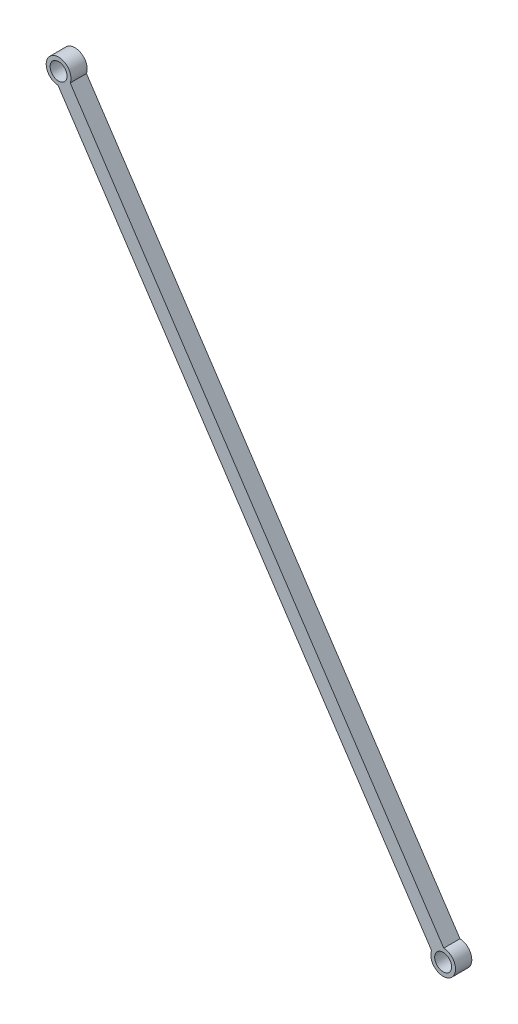
ISO-10303-21;
HEADER;
FILE_DESCRIPTION(('STEP AP214'),'2;1');
FILE_NAME('part.step','',(''),(''),'','','');
FILE_SCHEMA(('AUTOMOTIVE_DESIGN { 1 0 10303 214 1 1 1 1 }'));
ENDSEC;
DATA;
#1=APPLICATION_CONTEXT('core data for automotive mechanical design processes');
#2=APPLICATION_PROTOCOL_DEFINITION('international standard','automotive_design',2000,#1);
#3=PRODUCT_CONTEXT('',#1,'mechanical');
#4=PRODUCT('Part','Part','',(#3));
#5=PRODUCT_RELATED_PRODUCT_CATEGORY('part','',(#4));
#6=PRODUCT_DEFINITION_FORMATION('','',#4);
#7=PRODUCT_DEFINITION_CONTEXT('part definition',#1,'design');
#8=PRODUCT_DEFINITION('design','',#6,#7);
#9=PRODUCT_DEFINITION_SHAPE('','',#8);
#10=(LENGTH_UNIT() NAMED_UNIT(*) SI_UNIT(.MILLI.,.METRE.));
#11=(NAMED_UNIT(*) PLANE_ANGLE_UNIT() SI_UNIT($,.RADIAN.));
#12=(NAMED_UNIT(*) SI_UNIT($,.STERADIAN.) SOLID_ANGLE_UNIT());
#13=UNCERTAINTY_MEASURE_WITH_UNIT(LENGTH_MEASURE(1.E-05),#10,'distance_accuracy_value','');
#14=(GEOMETRIC_REPRESENTATION_CONTEXT(3) GLOBAL_UNCERTAINTY_ASSIGNED_CONTEXT((#13)) GLOBAL_UNIT_ASSIGNED_CONTEXT((#10,
#11,#12)) REPRESENTATION_CONTEXT('',''));
#15=CARTESIAN_POINT('',(0.,0.,0.));
#16=DIRECTION('',(0.,0.,1.));
#17=DIRECTION('',(1.,0.,0.));
#18=AXIS2_PLACEMENT_3D('',#15,#16,#17);
#19=CARTESIAN_POINT('',(-6.15167168991387,-3.239035274185,57.2847015149987));
#20=DIRECTION('',(0.,0.,-1.));
#21=DIRECTION('',(-1.,0.,0.));
#22=AXIS2_PLACEMENT_3D('',#19,#20,#21);
#23=CYLINDRICAL_SURFACE('',#22,0.65);
#24=CARTESIAN_POINT('',(-6.15167168991387,-3.239035274185,0.));
#25=DIRECTION('',(0.,0.,1.));
#26=DIRECTION('',(1.,0.,0.));
#27=AXIS2_PLACEMENT_3D('',#24,#25,#26);
#28=CIRCLE('',#27,0.65);
#29=CARTESIAN_POINT('',(-5.50167168991387,-3.239035274185,0.));
#30=VERTEX_POINT('',#29);
#31=EDGE_CURVE('E102',#30,#30,#28,.T.);
#32=ORIENTED_EDGE('',*,*,#31,.F.);
#33=EDGE_LOOP('',(#32));
#34=FACE_BOUND('',#33,.T.);
#35=CARTESIAN_POINT('',(-6.15167168991387,-3.239035274185,1.24999999999999));
#36=DIRECTION('',(0.,0.,1.));
#37=DIRECTION('',(1.,0.,0.));
#38=AXIS2_PLACEMENT_3D('',#35,#36,#37);
#39=CIRCLE('',#38,0.65);
#40=CARTESIAN_POINT('',(-5.50167168991387,-3.239035274185,1.24999999999999));
#41=VERTEX_POINT('',#40);
#42=EDGE_CURVE('E93',#41,#41,#39,.T.);
#43=ORIENTED_EDGE('',*,*,#42,.T.);
#44=EDGE_LOOP('',(#43));
#45=FACE_BOUND('',#44,.T.);
#46=ADVANCED_FACE('F33',(#34,#45),#23,.F.);
#47=CARTESIAN_POINT('',(-7.04364938553278,-2.91211664437266,57.2847015149987));
#48=DIRECTION('',(0.833062757635113,0.553178490038596,0.));
#49=DIRECTION('',(-0.553178490038596,0.833062757635113,0.));
#50=AXIS2_PLACEMENT_3D('',#47,#48,#49);
#51=PLANE('',#50);
#52=DIRECTION('',(0.553178490038596,-0.833062757635113,0.));
#53=VECTOR('',#52,1.);
#54=CARTESIAN_POINT('',(-7.04364938553278,-2.91211664437266,1.24999999999999));
#55=LINE('',#54,#53);
#56=CARTESIAN_POINT('',(-35.7352400356063,40.2961715633277,1.24999999999999));
#57=VERTEX_POINT('',#56);
#58=CARTESIAN_POINT('',(-7.04364938553278,-2.91211664437266,1.24999999999999));
#59=VERTEX_POINT('',#58);
#60=EDGE_CURVE('E78',#57,#59,#55,.T.);
#61=ORIENTED_EDGE('',*,*,#60,.F.);
#62=DIRECTION('',(0.,0.,-1.));
#63=VECTOR('',#62,1.);
#64=CARTESIAN_POINT('',(-35.7352400356063,40.2961715633277,57.2847015149987));
#65=LINE('',#64,#63);
#66=CARTESIAN_POINT('',(-35.7352400356063,40.2961715633277,0.));
#67=VERTEX_POINT('',#66);
#68=EDGE_CURVE('E49',#57,#67,#65,.T.);
#69=ORIENTED_EDGE('',*,*,#68,.T.);
#70=DIRECTION('',(0.553178490038596,-0.833062757635113,0.));
#71=VECTOR('',#70,1.);
#72=CARTESIAN_POINT('',(-7.04364938553278,-2.91211664437266,0.));
#73=LINE('',#72,#71);
#74=CARTESIAN_POINT('',(-7.04364938553278,-2.91211664437266,0.));
#75=VERTEX_POINT('',#74);
#76=EDGE_CURVE('E81',#67,#75,#73,.T.);
#77=ORIENTED_EDGE('',*,*,#76,.T.);
#78=DIRECTION('',(0.,0.,-1.));
#79=VECTOR('',#78,1.);
#80=CARTESIAN_POINT('',(-7.04364938553278,-2.91211664437266,57.2847015149987));
#81=LINE('',#80,#79);
#82=EDGE_CURVE('E74',#59,#75,#81,.T.);
#83=ORIENTED_EDGE('',*,*,#82,.F.);
#84=EDGE_LOOP('',(#61,#69,#77,#83));
#85=FACE_BOUND('',#84,.T.);
#86=ADVANCED_FACE('F76',(#85),#51,.F.);
#87=CARTESIAN_POINT('',(-35.6904735741643,41.2451162213188,57.2847015149987));
#88=DIRECTION('',(0.,0.,-1.));
#89=DIRECTION('',(-1.,0.,0.));
#90=AXIS2_PLACEMENT_3D('',#87,#88,#89);
#91=CYLINDRICAL_SURFACE('',#90,0.949999999999997);
#92=CARTESIAN_POINT('',(-35.6904735741643,41.2451162213188,1.24999999999999));
#93=DIRECTION('',(0.,0.,1.));
#94=DIRECTION('',(1.,0.,0.));
#95=AXIS2_PLACEMENT_3D('',#92,#93,#94);
#96=CIRCLE('',#95,0.949999999999997);
#97=CARTESIAN_POINT('',(-34.7984958785454,40.9181975915065,1.24999999999999));
#98=VERTEX_POINT('',#97);
#99=EDGE_CURVE('E92',#98,#57,#96,.T.);
#100=ORIENTED_EDGE('',*,*,#99,.F.);
#101=DIRECTION('',(0.,0.,-1.));
#102=VECTOR('',#101,1.);
#103=CARTESIAN_POINT('',(-34.7984958785454,40.9181975915065,57.2847015149987));
#104=LINE('',#103,#102);
#105=CARTESIAN_POINT('',(-34.7984958785454,40.9181975915065,0.));
#106=VERTEX_POINT('',#105);
#107=EDGE_CURVE('E42',#98,#106,#104,.T.);
#108=ORIENTED_EDGE('',*,*,#107,.T.);
#109=CARTESIAN_POINT('',(-35.6904735741643,41.2451162213188,0.));
#110=DIRECTION('',(0.,0.,1.));
#111=DIRECTION('',(1.,0.,0.));
#112=AXIS2_PLACEMENT_3D('',#109,#110,#111);
#113=CIRCLE('',#112,0.949999999999997);
#114=EDGE_CURVE('E110',#106,#67,#113,.T.);
#115=ORIENTED_EDGE('',*,*,#114,.T.);
#116=ORIENTED_EDGE('',*,*,#68,.F.);
#117=EDGE_LOOP('',(#100,#108,#115,#116));
#118=FACE_BOUND('',#117,.T.);
#119=ADVANCED_FACE('F114',(#118),#91,.T.);
#120=CARTESIAN_POINT('',(-6.1069052284718,-2.29009061619384,57.2847015149987));
#121=DIRECTION('',(-0.833062757635113,-0.553178490038596,0.));
#122=DIRECTION('',(0.553178490038596,-0.833062757635113,0.));
#123=AXIS2_PLACEMENT_3D('',#120,#121,#122);
#124=PLANE('',#123);
#125=DIRECTION('',(-0.553178490038596,0.833062757635113,0.));
#126=VECTOR('',#125,1.);
#127=CARTESIAN_POINT('',(-6.1069052284718,-2.29009061619384,1.24999999999999));
#128=LINE('',#127,#126);
#129=CARTESIAN_POINT('',(-6.1069052284718,-2.29009061619384,1.24999999999999));
#130=VERTEX_POINT('',#129);
#131=EDGE_CURVE('E56',#130,#98,#128,.T.);
#132=ORIENTED_EDGE('',*,*,#131,.F.);
#133=DIRECTION('',(0.,0.,-1.));
#134=VECTOR('',#133,1.);
#135=CARTESIAN_POINT('',(-6.1069052284718,-2.29009061619384,57.2847015149987));
#136=LINE('',#135,#134);
#137=CARTESIAN_POINT('',(-6.1069052284718,-2.29009061619384,0.));
#138=VERTEX_POINT('',#137);
#139=EDGE_CURVE('E11',#130,#138,#136,.T.);
#140=ORIENTED_EDGE('',*,*,#139,.T.);
#141=DIRECTION('',(-0.553178490038596,0.833062757635113,0.));
#142=VECTOR('',#141,1.);
#143=CARTESIAN_POINT('',(-6.1069052284718,-2.29009061619384,0.));
#144=LINE('',#143,#142);
#145=EDGE_CURVE('E107',#138,#106,#144,.T.);
#146=ORIENTED_EDGE('',*,*,#145,.T.);
#147=ORIENTED_EDGE('',*,*,#107,.F.);
#148=EDGE_LOOP('',(#132,#140,#146,#147));
#149=FACE_BOUND('',#148,.T.);
#150=ADVANCED_FACE('F117',(#149),#124,.F.);
#151=CARTESIAN_POINT('',(-6.15167168991387,-3.239035274185,57.2847015149987));
#152=DIRECTION('',(0.,0.,-1.));
#153=DIRECTION('',(-1.,0.,0.));
#154=AXIS2_PLACEMENT_3D('',#151,#152,#153);
#155=CYLINDRICAL_SURFACE('',#154,0.95);
#156=CARTESIAN_POINT('',(-6.15167168991387,-3.239035274185,1.24999999999999));
#157=DIRECTION('',(0.,0.,1.));
#158=DIRECTION('',(1.,0.,0.));
#159=AXIS2_PLACEMENT_3D('',#156,#157,#158);
#160=CIRCLE('',#159,0.95);
#161=EDGE_CURVE('E87',#59,#130,#160,.T.);
#162=ORIENTED_EDGE('',*,*,#161,.F.);
#163=ORIENTED_EDGE('',*,*,#82,.T.);
#164=CARTESIAN_POINT('',(-6.15167168991387,-3.239035274185,0.));
#165=DIRECTION('',(0.,0.,1.));
#166=DIRECTION('',(1.,0.,0.));
#167=AXIS2_PLACEMENT_3D('',#164,#165,#166);
#168=CIRCLE('',#167,0.95);
#169=EDGE_CURVE('E105',#75,#138,#168,.T.);
#170=ORIENTED_EDGE('',*,*,#169,.T.);
#171=ORIENTED_EDGE('',*,*,#139,.F.);
#172=EDGE_LOOP('',(#162,#163,#170,#171));
#173=FACE_BOUND('',#172,.T.);
#174=ADVANCED_FACE('F35',(#173),#155,.T.);
#175=CARTESIAN_POINT('',(-6.15167168991387,-3.239035274185,0.));
#176=DIRECTION('',(0.,0.,1.));
#177=DIRECTION('',(1.,0.,0.));
#178=AXIS2_PLACEMENT_3D('',#175,#176,#177);
#179=PLANE('',#178);
#180=ORIENTED_EDGE('',*,*,#169,.F.);
#181=ORIENTED_EDGE('',*,*,#76,.F.);
#182=ORIENTED_EDGE('',*,*,#114,.F.);
#183=ORIENTED_EDGE('',*,*,#145,.F.);
#184=EDGE_LOOP('',(#180,#181,#182,#183));
#185=FACE_BOUND('',#184,.T.);
#186=ORIENTED_EDGE('',*,*,#31,.T.);
#187=EDGE_LOOP('',(#186));
#188=FACE_BOUND('',#187,.T.);
#189=CARTESIAN_POINT('',(-35.6904735741643,41.2451162213188,0.));
#190=DIRECTION('',(0.,0.,1.));
#191=DIRECTION('',(1.,0.,0.));
#192=AXIS2_PLACEMENT_3D('',#189,#190,#191);
#193=CIRCLE('',#192,0.649999999999997);
#194=CARTESIAN_POINT('',(-35.0404735741643,41.2451162213188,0.));
#195=VERTEX_POINT('',#194);
#196=EDGE_CURVE('E89',#195,#195,#193,.T.);
#197=ORIENTED_EDGE('',*,*,#196,.T.);
#198=EDGE_LOOP('',(#197));
#199=FACE_BOUND('',#198,.T.);
#200=ADVANCED_FACE('F119',(#185,#188,#199),#179,.F.);
#201=CARTESIAN_POINT('',(-35.6904735741643,41.2451162213188,57.2847015149987));
#202=DIRECTION('',(0.,0.,-1.));
#203=DIRECTION('',(-1.,0.,0.));
#204=AXIS2_PLACEMENT_3D('',#201,#202,#203);
#205=CYLINDRICAL_SURFACE('',#204,0.649999999999997);
#206=ORIENTED_EDGE('',*,*,#196,.F.);
#207=EDGE_LOOP('',(#206));
#208=FACE_BOUND('',#207,.T.);
#209=CARTESIAN_POINT('',(-35.6904735741643,41.2451162213188,1.24999999999999));
#210=DIRECTION('',(0.,0.,1.));
#211=DIRECTION('',(1.,0.,0.));
#212=AXIS2_PLACEMENT_3D('',#209,#210,#211);
#213=CIRCLE('',#212,0.649999999999997);
#214=CARTESIAN_POINT('',(-35.0404735741643,41.2451162213188,1.24999999999999));
#215=VERTEX_POINT('',#214);
#216=EDGE_CURVE('E37',#215,#215,#213,.T.);
#217=ORIENTED_EDGE('',*,*,#216,.T.);
#218=EDGE_LOOP('',(#217));
#219=FACE_BOUND('',#218,.T.);
#220=ADVANCED_FACE('F122',(#208,#219),#205,.F.);
#221=CARTESIAN_POINT('',(0.,0.,1.25));
#222=DIRECTION('',(0.,0.,1.));
#223=DIRECTION('',(1.,0.,0.));
#224=AXIS2_PLACEMENT_3D('',#221,#222,#223);
#225=PLANE('',#224);
#226=ORIENTED_EDGE('',*,*,#216,.F.);
#227=EDGE_LOOP('',(#226));
#228=FACE_BOUND('',#227,.T.);
#229=ORIENTED_EDGE('',*,*,#42,.F.);
#230=EDGE_LOOP('',(#229));
#231=FACE_BOUND('',#230,.T.);
#232=ORIENTED_EDGE('',*,*,#60,.T.);
#233=ORIENTED_EDGE('',*,*,#161,.T.);
#234=ORIENTED_EDGE('',*,*,#131,.T.);
#235=ORIENTED_EDGE('',*,*,#99,.T.);
#236=EDGE_LOOP('',(#232,#233,#234,#235));
#237=FACE_BOUND('',#236,.T.);
#238=ADVANCED_FACE('F91',(#228,#231,#237),#225,.T.);
#239=CLOSED_SHELL('',(#46,#86,#119,#150,#174,#200,#220,#238));
#240=MANIFOLD_SOLID_BREP('B2',#239);
#241=ADVANCED_BREP_SHAPE_REPRESENTATION('',(#18,#240),#14);
#242=SHAPE_DEFINITION_REPRESENTATION(#9,#241);
ENDSEC;
END-ISO-10303-21;
